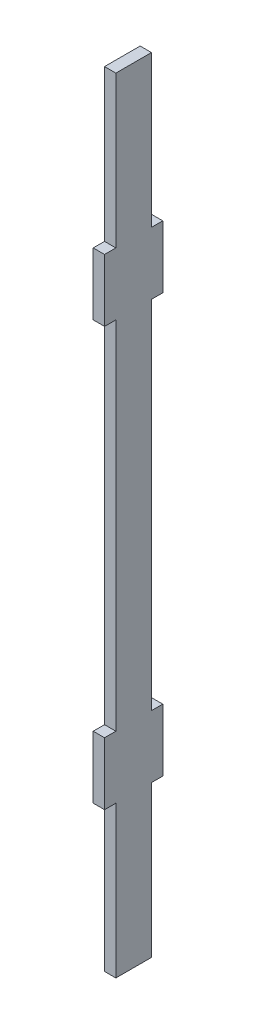
ISO-10303-21;
HEADER;
FILE_DESCRIPTION(('STEP AP214'),'2;1');
FILE_NAME('part.step','',(''),(''),'','','');
FILE_SCHEMA(('AUTOMOTIVE_DESIGN { 1 0 10303 214 1 1 1 1 }'));
ENDSEC;
DATA;
#1=APPLICATION_CONTEXT('core data for automotive mechanical design processes');
#2=APPLICATION_PROTOCOL_DEFINITION('international standard','automotive_design',2000,#1);
#3=PRODUCT_CONTEXT('',#1,'mechanical');
#4=PRODUCT('Part','Part','',(#3));
#5=PRODUCT_RELATED_PRODUCT_CATEGORY('part','',(#4));
#6=PRODUCT_DEFINITION_FORMATION('','',#4);
#7=PRODUCT_DEFINITION_CONTEXT('part definition',#1,'design');
#8=PRODUCT_DEFINITION('design','',#6,#7);
#9=PRODUCT_DEFINITION_SHAPE('','',#8);
#10=(LENGTH_UNIT() NAMED_UNIT(*) SI_UNIT(.MILLI.,.METRE.));
#11=(NAMED_UNIT(*) PLANE_ANGLE_UNIT() SI_UNIT($,.RADIAN.));
#12=(NAMED_UNIT(*) SI_UNIT($,.STERADIAN.) SOLID_ANGLE_UNIT());
#13=UNCERTAINTY_MEASURE_WITH_UNIT(LENGTH_MEASURE(1.E-05),#10,'distance_accuracy_value','');
#14=(GEOMETRIC_REPRESENTATION_CONTEXT(3) GLOBAL_UNCERTAINTY_ASSIGNED_CONTEXT((#13)) GLOBAL_UNIT_ASSIGNED_CONTEXT((#10,
#11,#12)) REPRESENTATION_CONTEXT('',''));
#15=CARTESIAN_POINT('',(0.,0.,0.));
#16=DIRECTION('',(0.,0.,1.));
#17=DIRECTION('',(1.,0.,0.));
#18=AXIS2_PLACEMENT_3D('',#15,#16,#17);
#19=CARTESIAN_POINT('',(6.35,134.999999999998,-5.));
#20=DIRECTION('',(0.,0.,1.));
#21=DIRECTION('',(0.,-1.,0.));
#22=AXIS2_PLACEMENT_3D('',#19,#20,#21);
#23=PLANE('',#22);
#24=DIRECTION('',(0.,1.,0.));
#25=VECTOR('',#24,1.);
#26=CARTESIAN_POINT('',(0.,134.999999999998,-5.));
#27=LINE('',#26,#25);
#28=CARTESIAN_POINT('',(0.,134.999999999998,-5.));
#29=VERTEX_POINT('',#28);
#30=CARTESIAN_POINT('',(0.,219.999999999998,-4.99999999999995));
#31=VERTEX_POINT('',#30);
#32=EDGE_CURVE('E201',#29,#31,#27,.T.);
#33=ORIENTED_EDGE('',*,*,#32,.T.);
#34=DIRECTION('',(-1.,0.,0.));
#35=VECTOR('',#34,1.);
#36=CARTESIAN_POINT('',(6.35,219.999999999998,-4.99999999999995));
#37=LINE('',#36,#35);
#38=CARTESIAN_POINT('',(6.35,219.999999999998,-4.99999999999995));
#39=VERTEX_POINT('',#38);
#40=EDGE_CURVE('E11',#39,#31,#37,.T.);
#41=ORIENTED_EDGE('',*,*,#40,.F.);
#42=DIRECTION('',(0.,1.,0.));
#43=VECTOR('',#42,1.);
#44=CARTESIAN_POINT('',(6.35,134.999999999998,-5.));
#45=LINE('',#44,#43);
#46=CARTESIAN_POINT('',(6.35,134.999999999998,-5.));
#47=VERTEX_POINT('',#46);
#48=EDGE_CURVE('E240',#47,#39,#45,.T.);
#49=ORIENTED_EDGE('',*,*,#48,.F.);
#50=DIRECTION('',(-1.,0.,0.));
#51=VECTOR('',#50,1.);
#52=CARTESIAN_POINT('',(6.35,134.999999999998,-5.));
#53=LINE('',#52,#51);
#54=EDGE_CURVE('E197',#47,#29,#53,.T.);
#55=ORIENTED_EDGE('',*,*,#54,.T.);
#56=EDGE_LOOP('',(#33,#41,#49,#55));
#57=FACE_BOUND('',#56,.T.);
#58=ADVANCED_FACE('F33',(#57),#23,.F.);
#59=CARTESIAN_POINT('',(6.35,219.999999999998,15.));
#60=DIRECTION('',(0.,-1.,0.));
#61=DIRECTION('',(0.,0.,-1.));
#62=AXIS2_PLACEMENT_3D('',#59,#60,#61);
#63=PLANE('',#62);
#64=DIRECTION('',(0.,0.,1.));
#65=VECTOR('',#64,1.);
#66=CARTESIAN_POINT('',(0.,219.999999999998,15.));
#67=LINE('',#66,#65);
#68=CARTESIAN_POINT('',(0.,219.999999999998,15.));
#69=VERTEX_POINT('',#68);
#70=EDGE_CURVE('E204',#31,#69,#67,.T.);
#71=ORIENTED_EDGE('',*,*,#70,.T.);
#72=DIRECTION('',(-1.,0.,0.));
#73=VECTOR('',#72,1.);
#74=CARTESIAN_POINT('',(6.35,219.999999999998,15.));
#75=LINE('',#74,#73);
#76=CARTESIAN_POINT('',(6.35,219.999999999998,15.));
#77=VERTEX_POINT('',#76);
#78=EDGE_CURVE('E41',#77,#69,#75,.T.);
#79=ORIENTED_EDGE('',*,*,#78,.F.);
#80=DIRECTION('',(0.,0.,1.));
#81=VECTOR('',#80,1.);
#82=CARTESIAN_POINT('',(6.35,219.999999999998,15.));
#83=LINE('',#82,#81);
#84=EDGE_CURVE('E128',#39,#77,#83,.T.);
#85=ORIENTED_EDGE('',*,*,#84,.F.);
#86=ORIENTED_EDGE('',*,*,#40,.T.);
#87=EDGE_LOOP('',(#71,#79,#85,#86));
#88=FACE_BOUND('',#87,.T.);
#89=ADVANCED_FACE('F358',(#88),#63,.F.);
#90=CARTESIAN_POINT('',(6.35,134.999999999998,15.0000000000001));
#91=DIRECTION('',(0.,0.,-1.));
#92=DIRECTION('',(0.,1.,0.));
#93=AXIS2_PLACEMENT_3D('',#90,#91,#92);
#94=PLANE('',#93);
#95=DIRECTION('',(0.,-1.,0.));
#96=VECTOR('',#95,1.);
#97=CARTESIAN_POINT('',(0.,134.999999999998,15.0000000000001));
#98=LINE('',#97,#96);
#99=CARTESIAN_POINT('',(0.,134.999999999998,15.0000000000001));
#100=VERTEX_POINT('',#99);
#101=EDGE_CURVE('E206',#69,#100,#98,.T.);
#102=ORIENTED_EDGE('',*,*,#101,.T.);
#103=DIRECTION('',(-1.,0.,0.));
#104=VECTOR('',#103,1.);
#105=CARTESIAN_POINT('',(6.35,134.999999999998,15.0000000000001));
#106=LINE('',#105,#104);
#107=CARTESIAN_POINT('',(6.35,134.999999999998,15.0000000000001));
#108=VERTEX_POINT('',#107);
#109=EDGE_CURVE('E283',#108,#100,#106,.T.);
#110=ORIENTED_EDGE('',*,*,#109,.F.);
#111=DIRECTION('',(0.,-1.,0.));
#112=VECTOR('',#111,1.);
#113=CARTESIAN_POINT('',(6.35,134.999999999998,15.0000000000001));
#114=LINE('',#113,#112);
#115=EDGE_CURVE('E291',#77,#108,#114,.T.);
#116=ORIENTED_EDGE('',*,*,#115,.F.);
#117=ORIENTED_EDGE('',*,*,#78,.T.);
#118=EDGE_LOOP('',(#102,#110,#116,#117));
#119=FACE_BOUND('',#118,.T.);
#120=ADVANCED_FACE('F289',(#119),#94,.F.);
#121=CARTESIAN_POINT('',(6.35,134.999999999998,21.3500000000001));
#122=DIRECTION('',(0.,-1.,0.));
#123=DIRECTION('',(0.,0.,-1.));
#124=AXIS2_PLACEMENT_3D('',#121,#122,#123);
#125=PLANE('',#124);
#126=DIRECTION('',(0.,0.,1.));
#127=VECTOR('',#126,1.);
#128=CARTESIAN_POINT('',(0.,134.999999999998,21.3500000000001));
#129=LINE('',#128,#127);
#130=CARTESIAN_POINT('',(0.,134.999999999998,21.3500000000001));
#131=VERTEX_POINT('',#130);
#132=EDGE_CURVE('E208',#100,#131,#129,.T.);
#133=ORIENTED_EDGE('',*,*,#132,.T.);
#134=DIRECTION('',(-1.,0.,0.));
#135=VECTOR('',#134,1.);
#136=CARTESIAN_POINT('',(6.35,134.999999999998,21.3500000000001));
#137=LINE('',#136,#135);
#138=CARTESIAN_POINT('',(6.35,134.999999999998,21.3500000000001));
#139=VERTEX_POINT('',#138);
#140=EDGE_CURVE('E280',#139,#131,#137,.T.);
#141=ORIENTED_EDGE('',*,*,#140,.F.);
#142=DIRECTION('',(0.,0.,1.));
#143=VECTOR('',#142,1.);
#144=CARTESIAN_POINT('',(6.35,134.999999999998,21.3500000000001));
#145=LINE('',#144,#143);
#146=EDGE_CURVE('E309',#108,#139,#145,.T.);
#147=ORIENTED_EDGE('',*,*,#146,.F.);
#148=ORIENTED_EDGE('',*,*,#109,.T.);
#149=EDGE_LOOP('',(#133,#141,#147,#148));
#150=FACE_BOUND('',#149,.T.);
#151=ADVANCED_FACE('F300',(#150),#125,.F.);
#152=CARTESIAN_POINT('',(6.35,99.9999999999984,21.3500000000001));
#153=DIRECTION('',(0.,0.,-1.));
#154=DIRECTION('',(0.,1.,0.));
#155=AXIS2_PLACEMENT_3D('',#152,#153,#154);
#156=PLANE('',#155);
#157=DIRECTION('',(0.,-1.,0.));
#158=VECTOR('',#157,1.);
#159=CARTESIAN_POINT('',(0.,99.9999999999984,21.3500000000001));
#160=LINE('',#159,#158);
#161=CARTESIAN_POINT('',(0.,99.9999999999984,21.3500000000001));
#162=VERTEX_POINT('',#161);
#163=EDGE_CURVE('E210',#131,#162,#160,.T.);
#164=ORIENTED_EDGE('',*,*,#163,.T.);
#165=DIRECTION('',(-1.,0.,0.));
#166=VECTOR('',#165,1.);
#167=CARTESIAN_POINT('',(6.35,99.9999999999984,21.3500000000001));
#168=LINE('',#167,#166);
#169=CARTESIAN_POINT('',(6.35,99.9999999999984,21.3500000000001));
#170=VERTEX_POINT('',#169);
#171=EDGE_CURVE('E277',#170,#162,#168,.T.);
#172=ORIENTED_EDGE('',*,*,#171,.F.);
#173=DIRECTION('',(0.,-1.,0.));
#174=VECTOR('',#173,1.);
#175=CARTESIAN_POINT('',(6.35,99.9999999999984,21.3500000000001));
#176=LINE('',#175,#174);
#177=EDGE_CURVE('E306',#139,#170,#176,.T.);
#178=ORIENTED_EDGE('',*,*,#177,.F.);
#179=ORIENTED_EDGE('',*,*,#140,.T.);
#180=EDGE_LOOP('',(#164,#172,#178,#179));
#181=FACE_BOUND('',#180,.T.);
#182=ADVANCED_FACE('F304',(#181),#156,.F.);
#183=CARTESIAN_POINT('',(6.35,99.9999999999984,15.0000000000001));
#184=DIRECTION('',(0.,1.,0.));
#185=DIRECTION('',(0.,0.,1.));
#186=AXIS2_PLACEMENT_3D('',#183,#184,#185);
#187=PLANE('',#186);
#188=DIRECTION('',(0.,0.,-1.));
#189=VECTOR('',#188,1.);
#190=CARTESIAN_POINT('',(0.,99.9999999999984,15.0000000000001));
#191=LINE('',#190,#189);
#192=CARTESIAN_POINT('',(0.,99.9999999999984,15.0000000000001));
#193=VERTEX_POINT('',#192);
#194=EDGE_CURVE('E212',#162,#193,#191,.T.);
#195=ORIENTED_EDGE('',*,*,#194,.T.);
#196=DIRECTION('',(-1.,0.,0.));
#197=VECTOR('',#196,1.);
#198=CARTESIAN_POINT('',(6.35,99.9999999999984,15.0000000000001));
#199=LINE('',#198,#197);
#200=CARTESIAN_POINT('',(6.35,99.9999999999984,15.0000000000001));
#201=VERTEX_POINT('',#200);
#202=EDGE_CURVE('E274',#201,#193,#199,.T.);
#203=ORIENTED_EDGE('',*,*,#202,.F.);
#204=DIRECTION('',(0.,0.,-1.));
#205=VECTOR('',#204,1.);
#206=CARTESIAN_POINT('',(6.35,99.9999999999984,15.0000000000001));
#207=LINE('',#206,#205);
#208=EDGE_CURVE('E308',#170,#201,#207,.T.);
#209=ORIENTED_EDGE('',*,*,#208,.F.);
#210=ORIENTED_EDGE('',*,*,#171,.T.);
#211=EDGE_LOOP('',(#195,#203,#209,#210));
#212=FACE_BOUND('',#211,.T.);
#213=ADVANCED_FACE('F371',(#212),#187,.F.);
#214=CARTESIAN_POINT('',(6.35,-100.000000000002,15.0000000000001));
#215=DIRECTION('',(0.,0.,-1.));
#216=DIRECTION('',(0.,1.,0.));
#217=AXIS2_PLACEMENT_3D('',#214,#215,#216);
#218=PLANE('',#217);
#219=DIRECTION('',(0.,-1.,0.));
#220=VECTOR('',#219,1.);
#221=CARTESIAN_POINT('',(0.,-100.000000000002,15.0000000000001));
#222=LINE('',#221,#220);
#223=CARTESIAN_POINT('',(0.,-100.000000000002,15.0000000000001));
#224=VERTEX_POINT('',#223);
#225=EDGE_CURVE('E214',#193,#224,#222,.T.);
#226=ORIENTED_EDGE('',*,*,#225,.T.);
#227=DIRECTION('',(-1.,0.,0.));
#228=VECTOR('',#227,1.);
#229=CARTESIAN_POINT('',(6.35,-100.000000000002,15.0000000000001));
#230=LINE('',#229,#228);
#231=CARTESIAN_POINT('',(6.35,-100.000000000002,15.0000000000001));
#232=VERTEX_POINT('',#231);
#233=EDGE_CURVE('E271',#232,#224,#230,.T.);
#234=ORIENTED_EDGE('',*,*,#233,.F.);
#235=DIRECTION('',(0.,-1.,0.));
#236=VECTOR('',#235,1.);
#237=CARTESIAN_POINT('',(6.35,-100.000000000002,15.0000000000001));
#238=LINE('',#237,#236);
#239=EDGE_CURVE('E311',#201,#232,#238,.T.);
#240=ORIENTED_EDGE('',*,*,#239,.F.);
#241=ORIENTED_EDGE('',*,*,#202,.T.);
#242=EDGE_LOOP('',(#226,#234,#240,#241));
#243=FACE_BOUND('',#242,.T.);
#244=ADVANCED_FACE('F374',(#243),#218,.F.);
#245=CARTESIAN_POINT('',(6.35,-100.000000000002,15.0000000000001));
#246=DIRECTION('',(0.,-1.,0.));
#247=DIRECTION('',(0.,0.,-1.));
#248=AXIS2_PLACEMENT_3D('',#245,#246,#247);
#249=PLANE('',#248);
#250=DIRECTION('',(0.,0.,1.));
#251=VECTOR('',#250,1.);
#252=CARTESIAN_POINT('',(0.,-100.000000000002,15.0000000000001));
#253=LINE('',#252,#251);
#254=CARTESIAN_POINT('',(0.,-100.000000000002,21.3500000000001));
#255=VERTEX_POINT('',#254);
#256=EDGE_CURVE('E216',#224,#255,#253,.T.);
#257=ORIENTED_EDGE('',*,*,#256,.T.);
#258=DIRECTION('',(-1.,0.,0.));
#259=VECTOR('',#258,1.);
#260=CARTESIAN_POINT('',(6.35,-100.000000000002,21.3500000000001));
#261=LINE('',#260,#259);
#262=CARTESIAN_POINT('',(6.35,-100.000000000002,21.3500000000001));
#263=VERTEX_POINT('',#262);
#264=EDGE_CURVE('E268',#263,#255,#261,.T.);
#265=ORIENTED_EDGE('',*,*,#264,.F.);
#266=DIRECTION('',(0.,0.,1.));
#267=VECTOR('',#266,1.);
#268=CARTESIAN_POINT('',(6.35,-100.000000000002,15.0000000000001));
#269=LINE('',#268,#267);
#270=EDGE_CURVE('E317',#232,#263,#269,.T.);
#271=ORIENTED_EDGE('',*,*,#270,.F.);
#272=ORIENTED_EDGE('',*,*,#233,.T.);
#273=EDGE_LOOP('',(#257,#265,#271,#272));
#274=FACE_BOUND('',#273,.T.);
#275=ADVANCED_FACE('F378',(#274),#249,.F.);
#276=CARTESIAN_POINT('',(6.35,-100.000000000002,21.3500000000001));
#277=DIRECTION('',(0.,0.,-1.));
#278=DIRECTION('',(0.,1.,0.));
#279=AXIS2_PLACEMENT_3D('',#276,#277,#278);
#280=PLANE('',#279);
#281=DIRECTION('',(0.,-1.,0.));
#282=VECTOR('',#281,1.);
#283=CARTESIAN_POINT('',(0.,-100.000000000002,21.3500000000001));
#284=LINE('',#283,#282);
#285=CARTESIAN_POINT('',(0.,-135.000000000002,21.3500000000001));
#286=VERTEX_POINT('',#285);
#287=EDGE_CURVE('E218',#255,#286,#284,.T.);
#288=ORIENTED_EDGE('',*,*,#287,.T.);
#289=DIRECTION('',(-1.,0.,0.));
#290=VECTOR('',#289,1.);
#291=CARTESIAN_POINT('',(6.35,-135.000000000002,21.3500000000001));
#292=LINE('',#291,#290);
#293=CARTESIAN_POINT('',(6.35,-135.000000000002,21.3500000000001));
#294=VERTEX_POINT('',#293);
#295=EDGE_CURVE('E265',#294,#286,#292,.T.);
#296=ORIENTED_EDGE('',*,*,#295,.F.);
#297=DIRECTION('',(0.,-1.,0.));
#298=VECTOR('',#297,1.);
#299=CARTESIAN_POINT('',(6.35,-100.000000000002,21.3500000000001));
#300=LINE('',#299,#298);
#301=EDGE_CURVE('E319',#263,#294,#300,.T.);
#302=ORIENTED_EDGE('',*,*,#301,.F.);
#303=ORIENTED_EDGE('',*,*,#264,.T.);
#304=EDGE_LOOP('',(#288,#296,#302,#303));
#305=FACE_BOUND('',#304,.T.);
#306=ADVANCED_FACE('F382',(#305),#280,.F.);
#307=CARTESIAN_POINT('',(6.35,-135.000000000002,21.3500000000001));
#308=DIRECTION('',(0.,1.,0.));
#309=DIRECTION('',(0.,0.,1.));
#310=AXIS2_PLACEMENT_3D('',#307,#308,#309);
#311=PLANE('',#310);
#312=DIRECTION('',(0.,0.,-1.));
#313=VECTOR('',#312,1.);
#314=CARTESIAN_POINT('',(0.,-135.000000000002,21.3500000000001));
#315=LINE('',#314,#313);
#316=CARTESIAN_POINT('',(0.,-135.000000000002,15.0000000000001));
#317=VERTEX_POINT('',#316);
#318=EDGE_CURVE('E220',#286,#317,#315,.T.);
#319=ORIENTED_EDGE('',*,*,#318,.T.);
#320=DIRECTION('',(-1.,0.,0.));
#321=VECTOR('',#320,1.);
#322=CARTESIAN_POINT('',(6.35,-135.000000000002,15.0000000000001));
#323=LINE('',#322,#321);
#324=CARTESIAN_POINT('',(6.35,-135.000000000002,15.0000000000001));
#325=VERTEX_POINT('',#324);
#326=EDGE_CURVE('E262',#325,#317,#323,.T.);
#327=ORIENTED_EDGE('',*,*,#326,.F.);
#328=DIRECTION('',(0.,0.,-1.));
#329=VECTOR('',#328,1.);
#330=CARTESIAN_POINT('',(6.35,-135.000000000002,21.3500000000001));
#331=LINE('',#330,#329);
#332=EDGE_CURVE('E321',#294,#325,#331,.T.);
#333=ORIENTED_EDGE('',*,*,#332,.F.);
#334=ORIENTED_EDGE('',*,*,#295,.T.);
#335=EDGE_LOOP('',(#319,#327,#333,#334));
#336=FACE_BOUND('',#335,.T.);
#337=ADVANCED_FACE('F386',(#336),#311,.F.);
#338=CARTESIAN_POINT('',(6.35,-220.000000000002,15.0000000000002));
#339=DIRECTION('',(0.,0.,-1.));
#340=DIRECTION('',(0.,1.,0.));
#341=AXIS2_PLACEMENT_3D('',#338,#339,#340);
#342=PLANE('',#341);
#343=DIRECTION('',(0.,-1.,0.));
#344=VECTOR('',#343,1.);
#345=CARTESIAN_POINT('',(0.,-220.000000000002,15.0000000000002));
#346=LINE('',#345,#344);
#347=CARTESIAN_POINT('',(0.,-220.000000000002,15.0000000000002));
#348=VERTEX_POINT('',#347);
#349=EDGE_CURVE('E222',#317,#348,#346,.T.);
#350=ORIENTED_EDGE('',*,*,#349,.T.);
#351=DIRECTION('',(-1.,0.,0.));
#352=VECTOR('',#351,1.);
#353=CARTESIAN_POINT('',(6.35,-220.000000000002,15.0000000000002));
#354=LINE('',#353,#352);
#355=CARTESIAN_POINT('',(6.35,-220.000000000002,15.0000000000002));
#356=VERTEX_POINT('',#355);
#357=EDGE_CURVE('E259',#356,#348,#354,.T.);
#358=ORIENTED_EDGE('',*,*,#357,.F.);
#359=DIRECTION('',(0.,-1.,0.));
#360=VECTOR('',#359,1.);
#361=CARTESIAN_POINT('',(6.35,-220.000000000002,15.0000000000002));
#362=LINE('',#361,#360);
#363=EDGE_CURVE('E323',#325,#356,#362,.T.);
#364=ORIENTED_EDGE('',*,*,#363,.F.);
#365=ORIENTED_EDGE('',*,*,#326,.T.);
#366=EDGE_LOOP('',(#350,#358,#364,#365));
#367=FACE_BOUND('',#366,.T.);
#368=ADVANCED_FACE('F390',(#367),#342,.F.);
#369=CARTESIAN_POINT('',(6.35,-220.000000000002,5.00000000000005));
#370=DIRECTION('',(0.,1.,0.));
#371=DIRECTION('',(0.,0.,1.));
#372=AXIS2_PLACEMENT_3D('',#369,#370,#371);
#373=PLANE('',#372);
#374=DIRECTION('',(0.,0.,-1.));
#375=VECTOR('',#374,1.);
#376=CARTESIAN_POINT('',(0.,-220.000000000002,5.00000000000005));
#377=LINE('',#376,#375);
#378=CARTESIAN_POINT('',(0.,-220.000000000002,-5.00000000000012));
#379=VERTEX_POINT('',#378);
#380=EDGE_CURVE('E225',#348,#379,#377,.T.);
#381=ORIENTED_EDGE('',*,*,#380,.T.);
#382=DIRECTION('',(-1.,0.,0.));
#383=VECTOR('',#382,1.);
#384=CARTESIAN_POINT('',(6.35,-220.000000000002,-5.00000000000012));
#385=LINE('',#384,#383);
#386=CARTESIAN_POINT('',(6.35,-220.000000000002,-5.00000000000012));
#387=VERTEX_POINT('',#386);
#388=EDGE_CURVE('E256',#387,#379,#385,.T.);
#389=ORIENTED_EDGE('',*,*,#388,.F.);
#390=DIRECTION('',(0.,0.,-1.));
#391=VECTOR('',#390,1.);
#392=CARTESIAN_POINT('',(6.35,-220.000000000002,5.00000000000005));
#393=LINE('',#392,#391);
#394=EDGE_CURVE('E325',#356,#387,#393,.T.);
#395=ORIENTED_EDGE('',*,*,#394,.F.);
#396=ORIENTED_EDGE('',*,*,#357,.T.);
#397=EDGE_LOOP('',(#381,#389,#395,#396));
#398=FACE_BOUND('',#397,.T.);
#399=ADVANCED_FACE('F394',(#398),#373,.F.);
#400=CARTESIAN_POINT('',(6.35,-220.000000000002,-5.00000000000012));
#401=DIRECTION('',(0.,0.,1.));
#402=DIRECTION('',(0.,-1.,0.));
#403=AXIS2_PLACEMENT_3D('',#400,#401,#402);
#404=PLANE('',#403);
#405=DIRECTION('',(0.,1.,0.));
#406=VECTOR('',#405,1.);
#407=CARTESIAN_POINT('',(0.,-220.000000000002,-5.00000000000012));
#408=LINE('',#407,#406);
#409=CARTESIAN_POINT('',(0.,-135.000000000002,-5.00000000000003));
#410=VERTEX_POINT('',#409);
#411=EDGE_CURVE('E227',#379,#410,#408,.T.);
#412=ORIENTED_EDGE('',*,*,#411,.T.);
#413=DIRECTION('',(-1.,0.,0.));
#414=VECTOR('',#413,1.);
#415=CARTESIAN_POINT('',(6.35,-135.000000000002,-5.00000000000003));
#416=LINE('',#415,#414);
#417=CARTESIAN_POINT('',(6.35,-135.000000000002,-5.00000000000003));
#418=VERTEX_POINT('',#417);
#419=EDGE_CURVE('E253',#418,#410,#416,.T.);
#420=ORIENTED_EDGE('',*,*,#419,.F.);
#421=DIRECTION('',(0.,1.,0.));
#422=VECTOR('',#421,1.);
#423=CARTESIAN_POINT('',(6.35,-220.000000000002,-5.00000000000012));
#424=LINE('',#423,#422);
#425=EDGE_CURVE('E327',#387,#418,#424,.T.);
#426=ORIENTED_EDGE('',*,*,#425,.F.);
#427=ORIENTED_EDGE('',*,*,#388,.T.);
#428=EDGE_LOOP('',(#412,#420,#426,#427));
#429=FACE_BOUND('',#428,.T.);
#430=ADVANCED_FACE('F398',(#429),#404,.F.);
#431=CARTESIAN_POINT('',(6.35,-135.000000000002,-11.35));
#432=DIRECTION('',(0.,1.,0.));
#433=DIRECTION('',(0.,0.,1.));
#434=AXIS2_PLACEMENT_3D('',#431,#432,#433);
#435=PLANE('',#434);
#436=DIRECTION('',(0.,0.,-1.));
#437=VECTOR('',#436,1.);
#438=CARTESIAN_POINT('',(0.,-135.000000000002,-11.35));
#439=LINE('',#438,#437);
#440=CARTESIAN_POINT('',(0.,-135.000000000002,-11.35));
#441=VERTEX_POINT('',#440);
#442=EDGE_CURVE('E229',#410,#441,#439,.T.);
#443=ORIENTED_EDGE('',*,*,#442,.T.);
#444=DIRECTION('',(-1.,0.,0.));
#445=VECTOR('',#444,1.);
#446=CARTESIAN_POINT('',(6.35,-135.000000000002,-11.35));
#447=LINE('',#446,#445);
#448=CARTESIAN_POINT('',(6.35,-135.000000000002,-11.35));
#449=VERTEX_POINT('',#448);
#450=EDGE_CURVE('E250',#449,#441,#447,.T.);
#451=ORIENTED_EDGE('',*,*,#450,.F.);
#452=DIRECTION('',(0.,0.,-1.));
#453=VECTOR('',#452,1.);
#454=CARTESIAN_POINT('',(6.35,-135.000000000002,-11.35));
#455=LINE('',#454,#453);
#456=EDGE_CURVE('E329',#418,#449,#455,.T.);
#457=ORIENTED_EDGE('',*,*,#456,.F.);
#458=ORIENTED_EDGE('',*,*,#419,.T.);
#459=EDGE_LOOP('',(#443,#451,#457,#458));
#460=FACE_BOUND('',#459,.T.);
#461=ADVANCED_FACE('F402',(#460),#435,.F.);
#462=CARTESIAN_POINT('',(6.35,-100.000000000002,-11.35));
#463=DIRECTION('',(0.,0.,1.));
#464=DIRECTION('',(0.,-1.,0.));
#465=AXIS2_PLACEMENT_3D('',#462,#463,#464);
#466=PLANE('',#465);
#467=DIRECTION('',(0.,1.,0.));
#468=VECTOR('',#467,1.);
#469=CARTESIAN_POINT('',(0.,-100.000000000002,-11.35));
#470=LINE('',#469,#468);
#471=CARTESIAN_POINT('',(0.,-100.000000000002,-11.35));
#472=VERTEX_POINT('',#471);
#473=EDGE_CURVE('E231',#441,#472,#470,.T.);
#474=ORIENTED_EDGE('',*,*,#473,.T.);
#475=DIRECTION('',(-1.,0.,0.));
#476=VECTOR('',#475,1.);
#477=CARTESIAN_POINT('',(6.35,-100.000000000002,-11.35));
#478=LINE('',#477,#476);
#479=CARTESIAN_POINT('',(6.35,-100.000000000002,-11.35));
#480=VERTEX_POINT('',#479);
#481=EDGE_CURVE('E247',#480,#472,#478,.T.);
#482=ORIENTED_EDGE('',*,*,#481,.F.);
#483=DIRECTION('',(0.,1.,0.));
#484=VECTOR('',#483,1.);
#485=CARTESIAN_POINT('',(6.35,-100.000000000002,-11.35));
#486=LINE('',#485,#484);
#487=EDGE_CURVE('E331',#449,#480,#486,.T.);
#488=ORIENTED_EDGE('',*,*,#487,.F.);
#489=ORIENTED_EDGE('',*,*,#450,.T.);
#490=EDGE_LOOP('',(#474,#482,#488,#489));
#491=FACE_BOUND('',#490,.T.);
#492=ADVANCED_FACE('F406',(#491),#466,.F.);
#493=CARTESIAN_POINT('',(6.35,-100.000000000002,-5.00000000000003));
#494=DIRECTION('',(0.,-1.,0.));
#495=DIRECTION('',(0.,0.,-1.));
#496=AXIS2_PLACEMENT_3D('',#493,#494,#495);
#497=PLANE('',#496);
#498=DIRECTION('',(0.,0.,1.));
#499=VECTOR('',#498,1.);
#500=CARTESIAN_POINT('',(0.,-100.000000000002,-5.00000000000003));
#501=LINE('',#500,#499);
#502=CARTESIAN_POINT('',(0.,-100.000000000002,-5.00000000000003));
#503=VERTEX_POINT('',#502);
#504=EDGE_CURVE('E233',#472,#503,#501,.T.);
#505=ORIENTED_EDGE('',*,*,#504,.T.);
#506=DIRECTION('',(-1.,0.,0.));
#507=VECTOR('',#506,1.);
#508=CARTESIAN_POINT('',(6.35,-100.000000000002,-5.00000000000003));
#509=LINE('',#508,#507);
#510=CARTESIAN_POINT('',(6.35,-100.000000000002,-5.00000000000003));
#511=VERTEX_POINT('',#510);
#512=EDGE_CURVE('E244',#511,#503,#509,.T.);
#513=ORIENTED_EDGE('',*,*,#512,.F.);
#514=DIRECTION('',(0.,0.,1.));
#515=VECTOR('',#514,1.);
#516=CARTESIAN_POINT('',(6.35,-100.000000000002,-5.00000000000003));
#517=LINE('',#516,#515);
#518=EDGE_CURVE('E333',#480,#511,#517,.T.);
#519=ORIENTED_EDGE('',*,*,#518,.F.);
#520=ORIENTED_EDGE('',*,*,#481,.T.);
#521=EDGE_LOOP('',(#505,#513,#519,#520));
#522=FACE_BOUND('',#521,.T.);
#523=ADVANCED_FACE('F339',(#522),#497,.F.);
#524=CARTESIAN_POINT('',(6.35,-100.000000000002,-5.00000000000003));
#525=DIRECTION('',(0.,0.,1.));
#526=DIRECTION('',(0.,-1.,0.));
#527=AXIS2_PLACEMENT_3D('',#524,#525,#526);
#528=PLANE('',#527);
#529=DIRECTION('',(0.,1.,0.));
#530=VECTOR('',#529,1.);
#531=CARTESIAN_POINT('',(0.,-100.000000000002,-5.00000000000003));
#532=LINE('',#531,#530);
#533=CARTESIAN_POINT('',(0.,99.9999999999984,-5.));
#534=VERTEX_POINT('',#533);
#535=EDGE_CURVE('E235',#503,#534,#532,.T.);
#536=ORIENTED_EDGE('',*,*,#535,.T.);
#537=DIRECTION('',(-1.,0.,0.));
#538=VECTOR('',#537,1.);
#539=CARTESIAN_POINT('',(6.35,99.9999999999984,-5.));
#540=LINE('',#539,#538);
#541=CARTESIAN_POINT('',(6.35,99.9999999999984,-5.));
#542=VERTEX_POINT('',#541);
#543=EDGE_CURVE('E192',#542,#534,#540,.T.);
#544=ORIENTED_EDGE('',*,*,#543,.F.);
#545=DIRECTION('',(0.,1.,0.));
#546=VECTOR('',#545,1.);
#547=CARTESIAN_POINT('',(6.35,-100.000000000002,-5.00000000000003));
#548=LINE('',#547,#546);
#549=EDGE_CURVE('E183',#511,#542,#548,.T.);
#550=ORIENTED_EDGE('',*,*,#549,.F.);
#551=ORIENTED_EDGE('',*,*,#512,.T.);
#552=EDGE_LOOP('',(#536,#544,#550,#551));
#553=FACE_BOUND('',#552,.T.);
#554=ADVANCED_FACE('F343',(#553),#528,.F.);
#555=CARTESIAN_POINT('',(6.35,99.9999999999984,-5.));
#556=DIRECTION('',(0.,1.,0.));
#557=DIRECTION('',(0.,0.,1.));
#558=AXIS2_PLACEMENT_3D('',#555,#556,#557);
#559=PLANE('',#558);
#560=DIRECTION('',(0.,0.,-1.));
#561=VECTOR('',#560,1.);
#562=CARTESIAN_POINT('',(0.,99.9999999999984,-5.));
#563=LINE('',#562,#561);
#564=CARTESIAN_POINT('',(0.,99.9999999999984,-11.35));
#565=VERTEX_POINT('',#564);
#566=EDGE_CURVE('E191',#534,#565,#563,.T.);
#567=ORIENTED_EDGE('',*,*,#566,.T.);
#568=DIRECTION('',(-1.,0.,0.));
#569=VECTOR('',#568,1.);
#570=CARTESIAN_POINT('',(6.35,99.9999999999984,-11.35));
#571=LINE('',#570,#569);
#572=CARTESIAN_POINT('',(6.35,99.9999999999984,-11.35));
#573=VERTEX_POINT('',#572);
#574=EDGE_CURVE('E188',#573,#565,#571,.T.);
#575=ORIENTED_EDGE('',*,*,#574,.F.);
#576=DIRECTION('',(0.,0.,-1.));
#577=VECTOR('',#576,1.);
#578=CARTESIAN_POINT('',(6.35,99.9999999999984,-5.));
#579=LINE('',#578,#577);
#580=EDGE_CURVE('E177',#542,#573,#579,.T.);
#581=ORIENTED_EDGE('',*,*,#580,.F.);
#582=ORIENTED_EDGE('',*,*,#543,.T.);
#583=EDGE_LOOP('',(#567,#575,#581,#582));
#584=FACE_BOUND('',#583,.T.);
#585=ADVANCED_FACE('F189',(#584),#559,.F.);
#586=CARTESIAN_POINT('',(6.35,99.9999999999984,-11.35));
#587=DIRECTION('',(0.,0.,1.));
#588=DIRECTION('',(0.,-1.,0.));
#589=AXIS2_PLACEMENT_3D('',#586,#587,#588);
#590=PLANE('',#589);
#591=DIRECTION('',(0.,1.,0.));
#592=VECTOR('',#591,1.);
#593=CARTESIAN_POINT('',(0.,99.9999999999984,-11.35));
#594=LINE('',#593,#592);
#595=CARTESIAN_POINT('',(0.,134.999999999998,-11.35));
#596=VERTEX_POINT('',#595);
#597=EDGE_CURVE('E114',#565,#596,#594,.T.);
#598=ORIENTED_EDGE('',*,*,#597,.T.);
#599=DIRECTION('',(-1.,0.,0.));
#600=VECTOR('',#599,1.);
#601=CARTESIAN_POINT('',(6.35,134.999999999998,-11.35));
#602=LINE('',#601,#600);
#603=CARTESIAN_POINT('',(6.35,134.999999999998,-11.35));
#604=VERTEX_POINT('',#603);
#605=EDGE_CURVE('E193',#604,#596,#602,.T.);
#606=ORIENTED_EDGE('',*,*,#605,.F.);
#607=DIRECTION('',(0.,1.,0.));
#608=VECTOR('',#607,1.);
#609=CARTESIAN_POINT('',(6.35,99.9999999999984,-11.35));
#610=LINE('',#609,#608);
#611=EDGE_CURVE('E181',#573,#604,#610,.T.);
#612=ORIENTED_EDGE('',*,*,#611,.F.);
#613=ORIENTED_EDGE('',*,*,#574,.T.);
#614=EDGE_LOOP('',(#598,#606,#612,#613));
#615=FACE_BOUND('',#614,.T.);
#616=ADVANCED_FACE('F195',(#615),#590,.F.);
#617=CARTESIAN_POINT('',(6.35,134.999999999998,-11.35));
#618=DIRECTION('',(0.,-1.,0.));
#619=DIRECTION('',(0.,0.,-1.));
#620=AXIS2_PLACEMENT_3D('',#617,#618,#619);
#621=PLANE('',#620);
#622=DIRECTION('',(0.,0.,1.));
#623=VECTOR('',#622,1.);
#624=CARTESIAN_POINT('',(0.,134.999999999998,-11.35));
#625=LINE('',#624,#623);
#626=EDGE_CURVE('E120',#596,#29,#625,.T.);
#627=ORIENTED_EDGE('',*,*,#626,.T.);
#628=ORIENTED_EDGE('',*,*,#54,.F.);
#629=DIRECTION('',(0.,0.,1.));
#630=VECTOR('',#629,1.);
#631=CARTESIAN_POINT('',(6.35,134.999999999998,-11.35));
#632=LINE('',#631,#630);
#633=EDGE_CURVE('E49',#604,#47,#632,.T.);
#634=ORIENTED_EDGE('',*,*,#633,.F.);
#635=ORIENTED_EDGE('',*,*,#605,.T.);
#636=EDGE_LOOP('',(#627,#628,#634,#635));
#637=FACE_BOUND('',#636,.T.);
#638=ADVANCED_FACE('F347',(#637),#621,.F.);
#639=CARTESIAN_POINT('',(6.35,0.,0.));
#640=DIRECTION('',(-1.,0.,0.));
#641=DIRECTION('',(0.,0.,1.));
#642=AXIS2_PLACEMENT_3D('',#639,#640,#641);
#643=PLANE('',#642);
#644=ORIENTED_EDGE('',*,*,#48,.T.);
#645=ORIENTED_EDGE('',*,*,#84,.T.);
#646=ORIENTED_EDGE('',*,*,#115,.T.);
#647=ORIENTED_EDGE('',*,*,#146,.T.);
#648=ORIENTED_EDGE('',*,*,#177,.T.);
#649=ORIENTED_EDGE('',*,*,#208,.T.);
#650=ORIENTED_EDGE('',*,*,#239,.T.);
#651=ORIENTED_EDGE('',*,*,#270,.T.);
#652=ORIENTED_EDGE('',*,*,#301,.T.);
#653=ORIENTED_EDGE('',*,*,#332,.T.);
#654=ORIENTED_EDGE('',*,*,#363,.T.);
#655=ORIENTED_EDGE('',*,*,#394,.T.);
#656=ORIENTED_EDGE('',*,*,#425,.T.);
#657=ORIENTED_EDGE('',*,*,#456,.T.);
#658=ORIENTED_EDGE('',*,*,#487,.T.);
#659=ORIENTED_EDGE('',*,*,#518,.T.);
#660=ORIENTED_EDGE('',*,*,#549,.T.);
#661=ORIENTED_EDGE('',*,*,#580,.T.);
#662=ORIENTED_EDGE('',*,*,#611,.T.);
#663=ORIENTED_EDGE('',*,*,#633,.T.);
#664=EDGE_LOOP('',(#644,#645,#646,#647,#648,#649,#650,#651,#652,#653,#654,#655,#656,#657,#658,
#659,#660,#661,#662,#663));
#665=FACE_BOUND('',#664,.T.);
#666=ADVANCED_FACE('F179',(#665),#643,.F.);
#667=CARTESIAN_POINT('',(0.,0.,0.));
#668=DIRECTION('',(-1.,0.,0.));
#669=DIRECTION('',(0.,0.,1.));
#670=AXIS2_PLACEMENT_3D('',#667,#668,#669);
#671=PLANE('',#670);
#672=ORIENTED_EDGE('',*,*,#32,.F.);
#673=ORIENTED_EDGE('',*,*,#626,.F.);
#674=ORIENTED_EDGE('',*,*,#597,.F.);
#675=ORIENTED_EDGE('',*,*,#566,.F.);
#676=ORIENTED_EDGE('',*,*,#535,.F.);
#677=ORIENTED_EDGE('',*,*,#504,.F.);
#678=ORIENTED_EDGE('',*,*,#473,.F.);
#679=ORIENTED_EDGE('',*,*,#442,.F.);
#680=ORIENTED_EDGE('',*,*,#411,.F.);
#681=ORIENTED_EDGE('',*,*,#380,.F.);
#682=ORIENTED_EDGE('',*,*,#349,.F.);
#683=ORIENTED_EDGE('',*,*,#318,.F.);
#684=ORIENTED_EDGE('',*,*,#287,.F.);
#685=ORIENTED_EDGE('',*,*,#256,.F.);
#686=ORIENTED_EDGE('',*,*,#225,.F.);
#687=ORIENTED_EDGE('',*,*,#194,.F.);
#688=ORIENTED_EDGE('',*,*,#163,.F.);
#689=ORIENTED_EDGE('',*,*,#132,.F.);
#690=ORIENTED_EDGE('',*,*,#101,.F.);
#691=ORIENTED_EDGE('',*,*,#70,.F.);
#692=EDGE_LOOP('',(#672,#673,#674,#675,#676,#677,#678,#679,#680,#681,#682,#683,#684,#685,#686,
#687,#688,#689,#690,#691));
#693=FACE_BOUND('',#692,.T.);
#694=ADVANCED_FACE('F295',(#693),#671,.T.);
#695=CLOSED_SHELL('',(#58,#89,#120,#151,#182,#213,#244,#275,#306,#337,#368,#399,#430,#461,#492,
#523,#554,#585,#616,#638,#666,#694));
#696=MANIFOLD_SOLID_BREP('B2',#695);
#697=ADVANCED_BREP_SHAPE_REPRESENTATION('',(#18,#696),#14);
#698=SHAPE_DEFINITION_REPRESENTATION(#9,#697);
ENDSEC;
END-ISO-10303-21;
